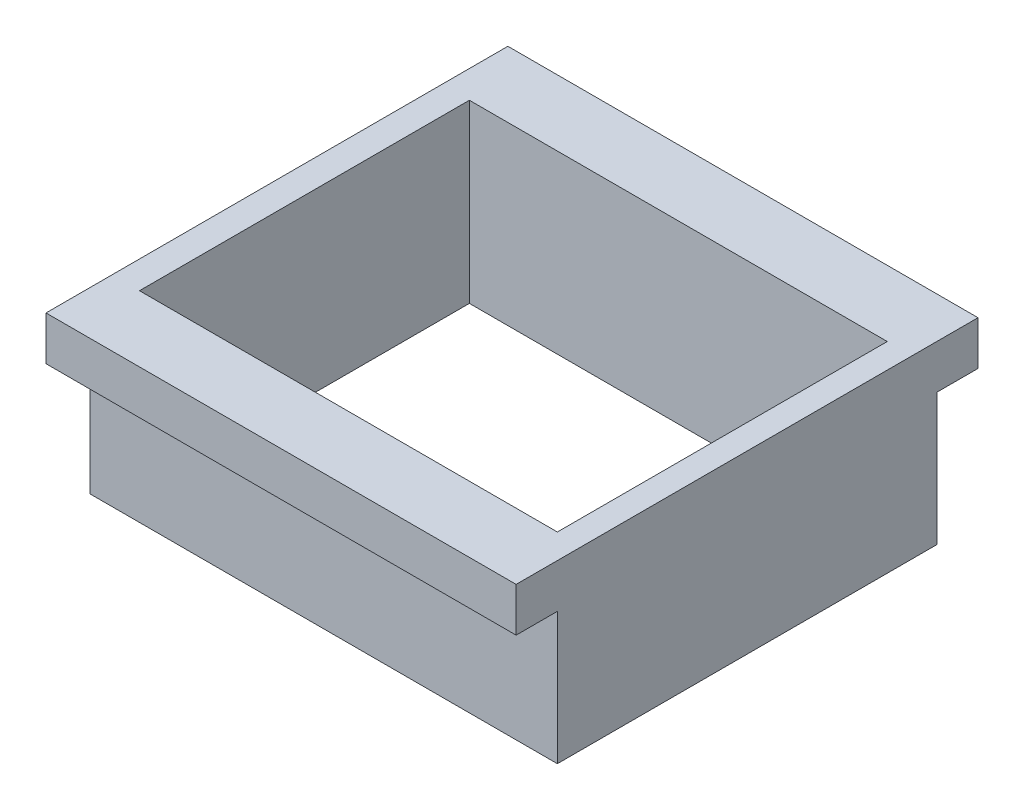
ISO-10303-21;
HEADER;
FILE_DESCRIPTION(('STEP AP214'),'2;1');
FILE_NAME('part.step','',(''),(''),'','','');
FILE_SCHEMA(('AUTOMOTIVE_DESIGN { 1 0 10303 214 1 1 1 1 }'));
ENDSEC;
DATA;
#1=APPLICATION_CONTEXT('core data for automotive mechanical design processes');
#2=APPLICATION_PROTOCOL_DEFINITION('international standard','automotive_design',2000,#1);
#3=PRODUCT_CONTEXT('',#1,'mechanical');
#4=PRODUCT('Part','Part','',(#3));
#5=PRODUCT_RELATED_PRODUCT_CATEGORY('part','',(#4));
#6=PRODUCT_DEFINITION_FORMATION('','',#4);
#7=PRODUCT_DEFINITION_CONTEXT('part definition',#1,'design');
#8=PRODUCT_DEFINITION('design','',#6,#7);
#9=PRODUCT_DEFINITION_SHAPE('','',#8);
#10=(LENGTH_UNIT() NAMED_UNIT(*) SI_UNIT(.MILLI.,.METRE.));
#11=(NAMED_UNIT(*) PLANE_ANGLE_UNIT() SI_UNIT($,.RADIAN.));
#12=(NAMED_UNIT(*) SI_UNIT($,.STERADIAN.) SOLID_ANGLE_UNIT());
#13=UNCERTAINTY_MEASURE_WITH_UNIT(LENGTH_MEASURE(1.E-05),#10,'distance_accuracy_value','');
#14=(GEOMETRIC_REPRESENTATION_CONTEXT(3) GLOBAL_UNCERTAINTY_ASSIGNED_CONTEXT((#13)) GLOBAL_UNIT_ASSIGNED_CONTEXT((#10,
#11,#12)) REPRESENTATION_CONTEXT('',''));
#15=CARTESIAN_POINT('',(0.,0.,0.));
#16=DIRECTION('',(0.,0.,1.));
#17=DIRECTION('',(1.,0.,0.));
#18=AXIS2_PLACEMENT_3D('',#15,#16,#17);
#19=CARTESIAN_POINT('',(0.,0.,0.));
#20=DIRECTION('',(0.,-1.,0.));
#21=DIRECTION('',(0.,0.,-1.));
#22=AXIS2_PLACEMENT_3D('',#19,#20,#21);
#23=PLANE('',#22);
#24=DIRECTION('',(0.,0.,1.));
#25=VECTOR('',#24,1.);
#26=CARTESIAN_POINT('',(-21.25,0.,17.25));
#27=LINE('',#26,#25);
#28=CARTESIAN_POINT('',(-21.25,0.,-17.25));
#29=VERTEX_POINT('',#28);
#30=CARTESIAN_POINT('',(-21.25,0.,17.25));
#31=VERTEX_POINT('',#30);
#32=EDGE_CURVE('E204',#29,#31,#27,.T.);
#33=ORIENTED_EDGE('',*,*,#32,.F.);
#34=DIRECTION('',(-1.,0.,0.));
#35=VECTOR('',#34,1.);
#36=CARTESIAN_POINT('',(-21.25,0.,-17.25));
#37=LINE('',#36,#35);
#38=CARTESIAN_POINT('',(21.25,0.,-17.25));
#39=VERTEX_POINT('',#38);
#40=EDGE_CURVE('E79',#39,#29,#37,.T.);
#41=ORIENTED_EDGE('',*,*,#40,.F.);
#42=DIRECTION('',(0.,0.,-1.));
#43=VECTOR('',#42,1.);
#44=CARTESIAN_POINT('',(21.25,0.,-17.25));
#45=LINE('',#44,#43);
#46=CARTESIAN_POINT('',(21.25,0.,17.25));
#47=VERTEX_POINT('',#46);
#48=EDGE_CURVE('E217',#47,#39,#45,.T.);
#49=ORIENTED_EDGE('',*,*,#48,.F.);
#50=DIRECTION('',(1.,0.,0.));
#51=VECTOR('',#50,1.);
#52=CARTESIAN_POINT('',(21.25,0.,17.25));
#53=LINE('',#52,#51);
#54=EDGE_CURVE('E215',#31,#47,#53,.T.);
#55=ORIENTED_EDGE('',*,*,#54,.F.);
#56=EDGE_LOOP('',(#33,#41,#49,#55));
#57=FACE_BOUND('',#56,.T.);
#58=DIRECTION('',(-1.,0.,0.));
#59=VECTOR('',#58,1.);
#60=CARTESIAN_POINT('',(-19.,0.,-15.));
#61=LINE('',#60,#59);
#62=CARTESIAN_POINT('',(19.,0.,-15.));
#63=VERTEX_POINT('',#62);
#64=CARTESIAN_POINT('',(-19.,0.,-15.));
#65=VERTEX_POINT('',#64);
#66=EDGE_CURVE('E142',#63,#65,#61,.T.);
#67=ORIENTED_EDGE('',*,*,#66,.T.);
#68=DIRECTION('',(0.,0.,1.));
#69=VECTOR('',#68,1.);
#70=CARTESIAN_POINT('',(-19.,0.,-15.));
#71=LINE('',#70,#69);
#72=CARTESIAN_POINT('',(-19.,0.,15.));
#73=VERTEX_POINT('',#72);
#74=EDGE_CURVE('E50',#65,#73,#71,.T.);
#75=ORIENTED_EDGE('',*,*,#74,.T.);
#76=DIRECTION('',(1.,0.,0.));
#77=VECTOR('',#76,1.);
#78=CARTESIAN_POINT('',(-19.,0.,15.));
#79=LINE('',#78,#77);
#80=CARTESIAN_POINT('',(19.,0.,15.));
#81=VERTEX_POINT('',#80);
#82=EDGE_CURVE('E192',#73,#81,#79,.T.);
#83=ORIENTED_EDGE('',*,*,#82,.T.);
#84=DIRECTION('',(0.,0.,-1.));
#85=VECTOR('',#84,1.);
#86=CARTESIAN_POINT('',(19.,0.,15.));
#87=LINE('',#86,#85);
#88=EDGE_CURVE('E195',#81,#63,#87,.T.);
#89=ORIENTED_EDGE('',*,*,#88,.T.);
#90=EDGE_LOOP('',(#67,#75,#83,#89));
#91=FACE_BOUND('',#90,.T.);
#92=ADVANCED_FACE('F35',(#57,#91),#23,.T.);
#93=CARTESIAN_POINT('',(-21.25,12.,17.25));
#94=DIRECTION('',(1.,0.,0.));
#95=DIRECTION('',(0.,0.,-1.));
#96=AXIS2_PLACEMENT_3D('',#93,#94,#95);
#97=PLANE('',#96);
#98=ORIENTED_EDGE('',*,*,#32,.T.);
#99=DIRECTION('',(0.,-1.,0.));
#100=VECTOR('',#99,1.);
#101=CARTESIAN_POINT('',(-21.25,12.,17.25));
#102=LINE('',#101,#100);
#103=CARTESIAN_POINT('',(-21.25,12.,17.25));
#104=VERTEX_POINT('',#103);
#105=EDGE_CURVE('E11',#104,#31,#102,.T.);
#106=ORIENTED_EDGE('',*,*,#105,.F.);
#107=DIRECTION('',(0.,0.,1.));
#108=VECTOR('',#107,1.);
#109=CARTESIAN_POINT('',(-21.25,12.,17.25));
#110=LINE('',#109,#108);
#111=CARTESIAN_POINT('',(-21.25,12.,-17.25));
#112=VERTEX_POINT('',#111);
#113=EDGE_CURVE('E205',#112,#104,#110,.T.);
#114=ORIENTED_EDGE('',*,*,#113,.F.);
#115=DIRECTION('',(0.,-1.,0.));
#116=VECTOR('',#115,1.);
#117=CARTESIAN_POINT('',(-21.25,12.,-17.25));
#118=LINE('',#117,#116);
#119=EDGE_CURVE('E212',#112,#29,#118,.T.);
#120=ORIENTED_EDGE('',*,*,#119,.T.);
#121=EDGE_LOOP('',(#98,#106,#114,#120));
#122=FACE_BOUND('',#121,.T.);
#123=ADVANCED_FACE('F37',(#122),#97,.F.);
#124=CARTESIAN_POINT('',(21.25,12.,17.25));
#125=DIRECTION('',(0.,0.,-1.));
#126=DIRECTION('',(-1.,0.,0.));
#127=AXIS2_PLACEMENT_3D('',#124,#125,#126);
#128=PLANE('',#127);
#129=ORIENTED_EDGE('',*,*,#54,.T.);
#130=DIRECTION('',(0.,-1.,0.));
#131=VECTOR('',#130,1.);
#132=CARTESIAN_POINT('',(21.25,12.,17.25));
#133=LINE('',#132,#131);
#134=CARTESIAN_POINT('',(21.25,12.,17.25));
#135=VERTEX_POINT('',#134);
#136=EDGE_CURVE('E43',#135,#47,#133,.T.);
#137=ORIENTED_EDGE('',*,*,#136,.F.);
#138=DIRECTION('',(1.,0.,0.));
#139=VECTOR('',#138,1.);
#140=CARTESIAN_POINT('',(21.25,12.,17.25));
#141=LINE('',#140,#139);
#142=EDGE_CURVE('E84',#104,#135,#141,.T.);
#143=ORIENTED_EDGE('',*,*,#142,.F.);
#144=ORIENTED_EDGE('',*,*,#105,.T.);
#145=EDGE_LOOP('',(#129,#137,#143,#144));
#146=FACE_BOUND('',#145,.T.);
#147=ADVANCED_FACE('F262',(#146),#128,.F.);
#148=CARTESIAN_POINT('',(21.25,12.,-17.25));
#149=DIRECTION('',(-1.,0.,0.));
#150=DIRECTION('',(0.,0.,1.));
#151=AXIS2_PLACEMENT_3D('',#148,#149,#150);
#152=PLANE('',#151);
#153=ORIENTED_EDGE('',*,*,#48,.T.);
#154=DIRECTION('',(0.,-1.,0.));
#155=VECTOR('',#154,1.);
#156=CARTESIAN_POINT('',(21.25,12.,-17.25));
#157=LINE('',#156,#155);
#158=CARTESIAN_POINT('',(21.25,12.,-17.25));
#159=VERTEX_POINT('',#158);
#160=EDGE_CURVE('E59',#159,#39,#157,.T.);
#161=ORIENTED_EDGE('',*,*,#160,.F.);
#162=DIRECTION('',(0.,0.,-1.));
#163=VECTOR('',#162,1.);
#164=CARTESIAN_POINT('',(21.25,12.,-21.));
#165=LINE('',#164,#163);
#166=CARTESIAN_POINT('',(21.25,12.,-21.));
#167=VERTEX_POINT('',#166);
#168=EDGE_CURVE('E177',#159,#167,#165,.T.);
#169=ORIENTED_EDGE('',*,*,#168,.T.);
#170=DIRECTION('',(0.,-1.,0.));
#171=VECTOR('',#170,1.);
#172=CARTESIAN_POINT('',(21.25,16.,-21.));
#173=LINE('',#172,#171);
#174=CARTESIAN_POINT('',(21.25,16.,-21.));
#175=VERTEX_POINT('',#174);
#176=EDGE_CURVE('E170',#175,#167,#173,.T.);
#177=ORIENTED_EDGE('',*,*,#176,.F.);
#178=DIRECTION('',(0.,0.,-1.));
#179=VECTOR('',#178,1.);
#180=CARTESIAN_POINT('',(21.25,16.,-21.));
#181=LINE('',#180,#179);
#182=CARTESIAN_POINT('',(21.25,16.,21.));
#183=VERTEX_POINT('',#182);
#184=EDGE_CURVE('E168',#183,#175,#181,.T.);
#185=ORIENTED_EDGE('',*,*,#184,.F.);
#186=DIRECTION('',(0.,-1.,0.));
#187=VECTOR('',#186,1.);
#188=CARTESIAN_POINT('',(21.25,16.,21.));
#189=LINE('',#188,#187);
#190=CARTESIAN_POINT('',(21.25,12.,21.));
#191=VERTEX_POINT('',#190);
#192=EDGE_CURVE('E182',#183,#191,#189,.T.);
#193=ORIENTED_EDGE('',*,*,#192,.T.);
#194=EDGE_CURVE('E164',#191,#135,#165,.T.);
#195=ORIENTED_EDGE('',*,*,#194,.T.);
#196=ORIENTED_EDGE('',*,*,#136,.T.);
#197=EDGE_LOOP('',(#153,#161,#169,#177,#185,#193,#195,#196));
#198=FACE_BOUND('',#197,.T.);
#199=ADVANCED_FACE('F223',(#198),#152,.F.);
#200=CARTESIAN_POINT('',(-21.25,12.,-17.25));
#201=DIRECTION('',(0.,0.,1.));
#202=DIRECTION('',(1.,0.,0.));
#203=AXIS2_PLACEMENT_3D('',#200,#201,#202);
#204=PLANE('',#203);
#205=ORIENTED_EDGE('',*,*,#40,.T.);
#206=ORIENTED_EDGE('',*,*,#119,.F.);
#207=DIRECTION('',(-1.,0.,0.));
#208=VECTOR('',#207,1.);
#209=CARTESIAN_POINT('',(-21.25,12.,-17.25));
#210=LINE('',#209,#208);
#211=EDGE_CURVE('E209',#159,#112,#210,.T.);
#212=ORIENTED_EDGE('',*,*,#211,.F.);
#213=ORIENTED_EDGE('',*,*,#160,.T.);
#214=EDGE_LOOP('',(#205,#206,#212,#213));
#215=FACE_BOUND('',#214,.T.);
#216=ADVANCED_FACE('F229',(#215),#204,.F.);
#217=CARTESIAN_POINT('',(-19.,12.,-15.));
#218=DIRECTION('',(1.,0.,0.));
#219=DIRECTION('',(0.,0.,-1.));
#220=AXIS2_PLACEMENT_3D('',#217,#218,#219);
#221=PLANE('',#220);
#222=ORIENTED_EDGE('',*,*,#74,.F.);
#223=DIRECTION('',(0.,-1.,0.));
#224=VECTOR('',#223,1.);
#225=CARTESIAN_POINT('',(-19.,12.,-15.));
#226=LINE('',#225,#224);
#227=CARTESIAN_POINT('',(-19.,16.,-15.));
#228=VERTEX_POINT('',#227);
#229=EDGE_CURVE('E132',#228,#65,#226,.T.);
#230=ORIENTED_EDGE('',*,*,#229,.F.);
#231=DIRECTION('',(0.,0.,1.));
#232=VECTOR('',#231,1.);
#233=CARTESIAN_POINT('',(-19.,16.,-15.));
#234=LINE('',#233,#232);
#235=CARTESIAN_POINT('',(-19.,16.,15.));
#236=VERTEX_POINT('',#235);
#237=EDGE_CURVE('E136',#228,#236,#234,.T.);
#238=ORIENTED_EDGE('',*,*,#237,.T.);
#239=DIRECTION('',(0.,-1.,0.));
#240=VECTOR('',#239,1.);
#241=CARTESIAN_POINT('',(-19.,12.,15.));
#242=LINE('',#241,#240);
#243=EDGE_CURVE('E202',#236,#73,#242,.T.);
#244=ORIENTED_EDGE('',*,*,#243,.T.);
#245=EDGE_LOOP('',(#222,#230,#238,#244));
#246=FACE_BOUND('',#245,.T.);
#247=ADVANCED_FACE('F134',(#246),#221,.T.);
#248=CARTESIAN_POINT('',(-19.,12.,15.));
#249=DIRECTION('',(0.,0.,-1.));
#250=DIRECTION('',(-1.,0.,0.));
#251=AXIS2_PLACEMENT_3D('',#248,#249,#250);
#252=PLANE('',#251);
#253=ORIENTED_EDGE('',*,*,#82,.F.);
#254=ORIENTED_EDGE('',*,*,#243,.F.);
#255=DIRECTION('',(1.,0.,0.));
#256=VECTOR('',#255,1.);
#257=CARTESIAN_POINT('',(-19.,16.,15.));
#258=LINE('',#257,#256);
#259=CARTESIAN_POINT('',(19.,16.,15.));
#260=VERTEX_POINT('',#259);
#261=EDGE_CURVE('E153',#236,#260,#258,.T.);
#262=ORIENTED_EDGE('',*,*,#261,.T.);
#263=DIRECTION('',(0.,-1.,0.));
#264=VECTOR('',#263,1.);
#265=CARTESIAN_POINT('',(19.,12.,15.));
#266=LINE('',#265,#264);
#267=EDGE_CURVE('E200',#260,#81,#266,.T.);
#268=ORIENTED_EDGE('',*,*,#267,.T.);
#269=EDGE_LOOP('',(#253,#254,#262,#268));
#270=FACE_BOUND('',#269,.T.);
#271=ADVANCED_FACE('F288',(#270),#252,.T.);
#272=CARTESIAN_POINT('',(19.,12.,15.));
#273=DIRECTION('',(-1.,0.,0.));
#274=DIRECTION('',(0.,0.,1.));
#275=AXIS2_PLACEMENT_3D('',#272,#273,#274);
#276=PLANE('',#275);
#277=ORIENTED_EDGE('',*,*,#88,.F.);
#278=ORIENTED_EDGE('',*,*,#267,.F.);
#279=DIRECTION('',(0.,0.,-1.));
#280=VECTOR('',#279,1.);
#281=CARTESIAN_POINT('',(19.,16.,15.));
#282=LINE('',#281,#280);
#283=CARTESIAN_POINT('',(19.,16.,-15.));
#284=VERTEX_POINT('',#283);
#285=EDGE_CURVE('E155',#260,#284,#282,.T.);
#286=ORIENTED_EDGE('',*,*,#285,.T.);
#287=DIRECTION('',(0.,-1.,0.));
#288=VECTOR('',#287,1.);
#289=CARTESIAN_POINT('',(19.,12.,-15.));
#290=LINE('',#289,#288);
#291=EDGE_CURVE('E141',#284,#63,#290,.T.);
#292=ORIENTED_EDGE('',*,*,#291,.T.);
#293=EDGE_LOOP('',(#277,#278,#286,#292));
#294=FACE_BOUND('',#293,.T.);
#295=ADVANCED_FACE('F294',(#294),#276,.T.);
#296=CARTESIAN_POINT('',(-19.,12.,-15.));
#297=DIRECTION('',(0.,0.,1.));
#298=DIRECTION('',(1.,0.,0.));
#299=AXIS2_PLACEMENT_3D('',#296,#297,#298);
#300=PLANE('',#299);
#301=ORIENTED_EDGE('',*,*,#66,.F.);
#302=ORIENTED_EDGE('',*,*,#291,.F.);
#303=DIRECTION('',(-1.,0.,0.));
#304=VECTOR('',#303,1.);
#305=CARTESIAN_POINT('',(19.,16.,-15.));
#306=LINE('',#305,#304);
#307=EDGE_CURVE('E145',#284,#228,#306,.T.);
#308=ORIENTED_EDGE('',*,*,#307,.T.);
#309=ORIENTED_EDGE('',*,*,#229,.T.);
#310=EDGE_LOOP('',(#301,#302,#308,#309));
#311=FACE_BOUND('',#310,.T.);
#312=ADVANCED_FACE('F146',(#311),#300,.T.);
#313=CARTESIAN_POINT('',(0.,16.,0.));
#314=DIRECTION('',(0.,-1.,0.));
#315=DIRECTION('',(0.,0.,-1.));
#316=AXIS2_PLACEMENT_3D('',#313,#314,#315);
#317=PLANE('',#316);
#318=DIRECTION('',(-1.,0.,0.));
#319=VECTOR('',#318,1.);
#320=CARTESIAN_POINT('',(-21.5,16.,-21.));
#321=LINE('',#320,#319);
#322=CARTESIAN_POINT('',(-21.5,16.,-21.));
#323=VERTEX_POINT('',#322);
#324=EDGE_CURVE('E160',#175,#323,#321,.T.);
#325=ORIENTED_EDGE('',*,*,#324,.T.);
#326=DIRECTION('',(0.,0.,1.));
#327=VECTOR('',#326,1.);
#328=CARTESIAN_POINT('',(-21.5,16.,21.));
#329=LINE('',#328,#327);
#330=CARTESIAN_POINT('',(-21.5,16.,21.));
#331=VERTEX_POINT('',#330);
#332=EDGE_CURVE('E163',#323,#331,#329,.T.);
#333=ORIENTED_EDGE('',*,*,#332,.T.);
#334=DIRECTION('',(1.,0.,0.));
#335=VECTOR('',#334,1.);
#336=CARTESIAN_POINT('',(21.25,16.,21.));
#337=LINE('',#336,#335);
#338=EDGE_CURVE('E166',#331,#183,#337,.T.);
#339=ORIENTED_EDGE('',*,*,#338,.T.);
#340=ORIENTED_EDGE('',*,*,#184,.T.);
#341=EDGE_LOOP('',(#325,#333,#339,#340));
#342=FACE_BOUND('',#341,.T.);
#343=ORIENTED_EDGE('',*,*,#307,.F.);
#344=ORIENTED_EDGE('',*,*,#285,.F.);
#345=ORIENTED_EDGE('',*,*,#261,.F.);
#346=ORIENTED_EDGE('',*,*,#237,.F.);
#347=EDGE_LOOP('',(#343,#344,#345,#346));
#348=FACE_BOUND('',#347,.T.);
#349=ADVANCED_FACE('F151',(#342,#348),#317,.F.);
#350=CARTESIAN_POINT('',(0.,12.,0.));
#351=DIRECTION('',(0.,-1.,0.));
#352=DIRECTION('',(0.,0.,-1.));
#353=AXIS2_PLACEMENT_3D('',#350,#351,#352);
#354=PLANE('',#353);
#355=ORIENTED_EDGE('',*,*,#113,.T.);
#356=ORIENTED_EDGE('',*,*,#142,.T.);
#357=ORIENTED_EDGE('',*,*,#194,.F.);
#358=DIRECTION('',(1.,0.,0.));
#359=VECTOR('',#358,1.);
#360=CARTESIAN_POINT('',(21.25,12.,21.));
#361=LINE('',#360,#359);
#362=CARTESIAN_POINT('',(-21.5,12.,21.));
#363=VERTEX_POINT('',#362);
#364=EDGE_CURVE('E175',#363,#191,#361,.T.);
#365=ORIENTED_EDGE('',*,*,#364,.F.);
#366=DIRECTION('',(0.,0.,1.));
#367=VECTOR('',#366,1.);
#368=CARTESIAN_POINT('',(-21.5,12.,21.));
#369=LINE('',#368,#367);
#370=CARTESIAN_POINT('',(-21.5,12.,-21.));
#371=VERTEX_POINT('',#370);
#372=EDGE_CURVE('E173',#371,#363,#369,.T.);
#373=ORIENTED_EDGE('',*,*,#372,.F.);
#374=DIRECTION('',(-1.,0.,0.));
#375=VECTOR('',#374,1.);
#376=CARTESIAN_POINT('',(-21.5,12.,-21.));
#377=LINE('',#376,#375);
#378=EDGE_CURVE('E159',#167,#371,#377,.T.);
#379=ORIENTED_EDGE('',*,*,#378,.F.);
#380=ORIENTED_EDGE('',*,*,#168,.F.);
#381=ORIENTED_EDGE('',*,*,#211,.T.);
#382=EDGE_LOOP('',(#355,#356,#357,#365,#373,#379,#380,#381));
#383=FACE_BOUND('',#382,.T.);
#384=ADVANCED_FACE('F232',(#383),#354,.T.);
#385=CARTESIAN_POINT('',(-21.5,16.,-21.));
#386=DIRECTION('',(0.,0.,1.));
#387=DIRECTION('',(1.,0.,0.));
#388=AXIS2_PLACEMENT_3D('',#385,#386,#387);
#389=PLANE('',#388);
#390=ORIENTED_EDGE('',*,*,#378,.T.);
#391=DIRECTION('',(0.,-1.,0.));
#392=VECTOR('',#391,1.);
#393=CARTESIAN_POINT('',(-21.5,16.,-21.));
#394=LINE('',#393,#392);
#395=EDGE_CURVE('E188',#323,#371,#394,.T.);
#396=ORIENTED_EDGE('',*,*,#395,.F.);
#397=ORIENTED_EDGE('',*,*,#324,.F.);
#398=ORIENTED_EDGE('',*,*,#176,.T.);
#399=EDGE_LOOP('',(#390,#396,#397,#398));
#400=FACE_BOUND('',#399,.T.);
#401=ADVANCED_FACE('F238',(#400),#389,.F.);
#402=CARTESIAN_POINT('',(-21.5,16.,21.));
#403=DIRECTION('',(1.,0.,0.));
#404=DIRECTION('',(0.,0.,-1.));
#405=AXIS2_PLACEMENT_3D('',#402,#403,#404);
#406=PLANE('',#405);
#407=ORIENTED_EDGE('',*,*,#372,.T.);
#408=DIRECTION('',(0.,-1.,0.));
#409=VECTOR('',#408,1.);
#410=CARTESIAN_POINT('',(-21.5,16.,21.));
#411=LINE('',#410,#409);
#412=EDGE_CURVE('E185',#331,#363,#411,.T.);
#413=ORIENTED_EDGE('',*,*,#412,.F.);
#414=ORIENTED_EDGE('',*,*,#332,.F.);
#415=ORIENTED_EDGE('',*,*,#395,.T.);
#416=EDGE_LOOP('',(#407,#413,#414,#415));
#417=FACE_BOUND('',#416,.T.);
#418=ADVANCED_FACE('F248',(#417),#406,.F.);
#419=CARTESIAN_POINT('',(21.25,16.,21.));
#420=DIRECTION('',(0.,0.,-1.));
#421=DIRECTION('',(-1.,0.,0.));
#422=AXIS2_PLACEMENT_3D('',#419,#420,#421);
#423=PLANE('',#422);
#424=ORIENTED_EDGE('',*,*,#364,.T.);
#425=ORIENTED_EDGE('',*,*,#192,.F.);
#426=ORIENTED_EDGE('',*,*,#338,.F.);
#427=ORIENTED_EDGE('',*,*,#412,.T.);
#428=EDGE_LOOP('',(#424,#425,#426,#427));
#429=FACE_BOUND('',#428,.T.);
#430=ADVANCED_FACE('F246',(#429),#423,.F.);
#431=CLOSED_SHELL('',(#92,#123,#147,#199,#216,#247,#271,#295,#312,#349,#384,#401,#418,#430));
#432=MANIFOLD_SOLID_BREP('B2',#431);
#433=ADVANCED_BREP_SHAPE_REPRESENTATION('',(#18,#432),#14);
#434=SHAPE_DEFINITION_REPRESENTATION(#9,#433);
ENDSEC;
END-ISO-10303-21;
